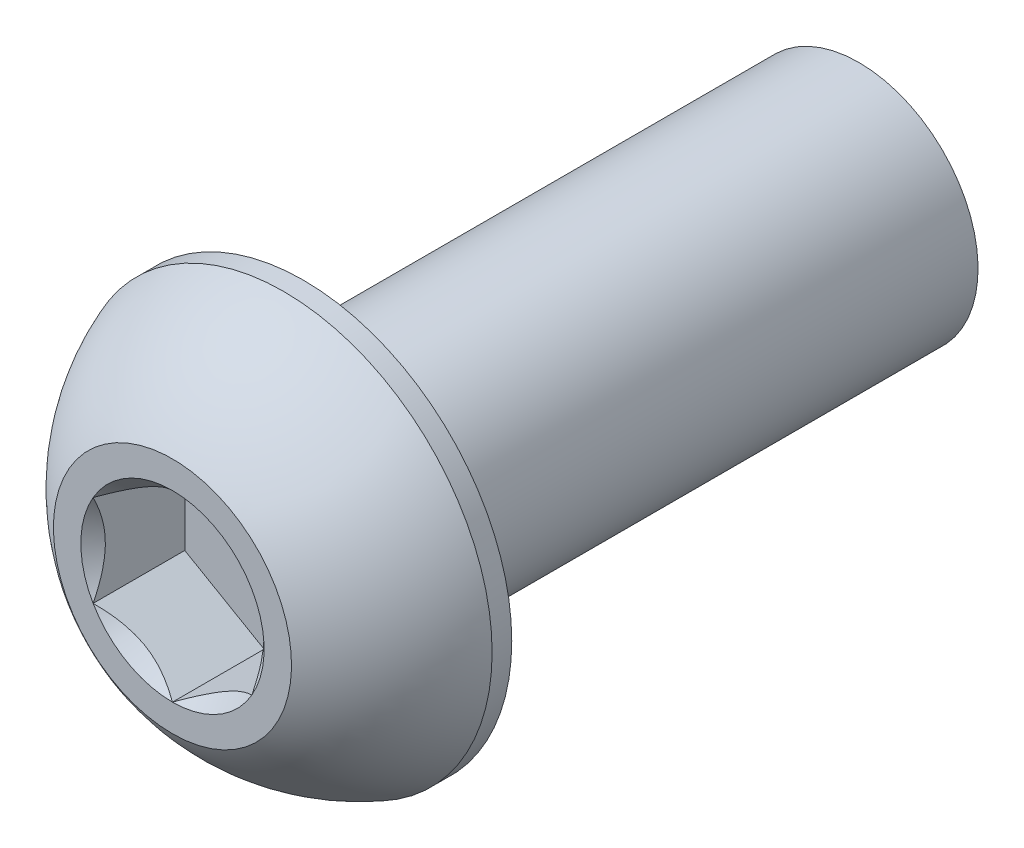
ISO-10303-21;
HEADER;
FILE_DESCRIPTION(('STEP AP214'),'2;1');
FILE_NAME('part.step','',(''),(''),'','','');
FILE_SCHEMA(('AUTOMOTIVE_DESIGN { 1 0 10303 214 1 1 1 1 }'));
ENDSEC;
DATA;
#1=APPLICATION_CONTEXT('core data for automotive mechanical design processes');
#2=APPLICATION_PROTOCOL_DEFINITION('international standard','automotive_design',2000,#1);
#3=PRODUCT_CONTEXT('',#1,'mechanical');
#4=PRODUCT('Part','Part','',(#3));
#5=PRODUCT_RELATED_PRODUCT_CATEGORY('part','',(#4));
#6=PRODUCT_DEFINITION_FORMATION('','',#4);
#7=PRODUCT_DEFINITION_CONTEXT('part definition',#1,'design');
#8=PRODUCT_DEFINITION('design','',#6,#7);
#9=PRODUCT_DEFINITION_SHAPE('','',#8);
#10=(LENGTH_UNIT() NAMED_UNIT(*) SI_UNIT(.MILLI.,.METRE.));
#11=(NAMED_UNIT(*) PLANE_ANGLE_UNIT() SI_UNIT($,.RADIAN.));
#12=(NAMED_UNIT(*) SI_UNIT($,.STERADIAN.) SOLID_ANGLE_UNIT());
#13=UNCERTAINTY_MEASURE_WITH_UNIT(LENGTH_MEASURE(1.E-05),#10,'distance_accuracy_value','');
#14=(GEOMETRIC_REPRESENTATION_CONTEXT(3) GLOBAL_UNCERTAINTY_ASSIGNED_CONTEXT((#13)) GLOBAL_UNIT_ASSIGNED_CONTEXT((#10,
#11,#12)) REPRESENTATION_CONTEXT('',''));
#15=CARTESIAN_POINT('',(0.,0.,0.));
#16=DIRECTION('',(0.,0.,1.));
#17=DIRECTION('',(1.,0.,0.));
#18=AXIS2_PLACEMENT_3D('',#15,#16,#17);
#19=CARTESIAN_POINT('',(-5.26,-5.25,-3.3));
#20=DIRECTION('',(0.,0.,-1.));
#21=DIRECTION('',(0.,1.,0.));
#22=AXIS2_PLACEMENT_3D('',#19,#20,#21);
#23=PLANE('',#22);
#24=CARTESIAN_POINT('',(0.,0.,-3.3));
#25=DIRECTION('',(0.,0.,1.));
#26=DIRECTION('',(1.,0.,0.));
#27=AXIS2_PLACEMENT_3D('',#24,#25,#26);
#28=CIRCLE('',#27,5.25);
#29=CARTESIAN_POINT('',(5.25,0.,-3.3));
#30=VERTEX_POINT('',#29);
#31=EDGE_CURVE('E371',#30,#30,#28,.T.);
#32=ORIENTED_EDGE('',*,*,#31,.F.);
#33=EDGE_LOOP('',(#32));
#34=FACE_BOUND('',#33,.T.);
#35=ADVANCED_FACE('F45',(#34),#23,.T.);
#36=CARTESIAN_POINT('',(2.,-1.15470053837925,-2.31));
#37=DIRECTION('',(0.,0.,1.));
#38=DIRECTION('',(1.,0.,0.));
#39=AXIS2_PLACEMENT_3D('',#36,#37,#38);
#40=PLANE('',#39);
#41=DIRECTION('',(0.866025403784438,0.5,0.));
#42=VECTOR('',#41,1.);
#43=CARTESIAN_POINT('',(0.,-2.3094010767585,-2.31));
#44=LINE('',#43,#42);
#45=CARTESIAN_POINT('',(0.,-2.3094010767585,-2.31));
#46=VERTEX_POINT('',#45);
#47=CARTESIAN_POINT('',(2.,-1.15470053837925,-2.31));
#48=VERTEX_POINT('',#47);
#49=EDGE_CURVE('E111',#46,#48,#44,.T.);
#50=ORIENTED_EDGE('',*,*,#49,.T.);
#51=DIRECTION('',(0.,1.,0.));
#52=VECTOR('',#51,1.);
#53=CARTESIAN_POINT('',(2.,-1.15470053837925,-2.31));
#54=LINE('',#53,#52);
#55=CARTESIAN_POINT('',(2.,1.15470053837925,-2.31));
#56=VERTEX_POINT('',#55);
#57=EDGE_CURVE('E168',#48,#56,#54,.T.);
#58=ORIENTED_EDGE('',*,*,#57,.T.);
#59=DIRECTION('',(-0.866025403784439,0.5,0.));
#60=VECTOR('',#59,1.);
#61=CARTESIAN_POINT('',(2.,1.15470053837925,-2.31));
#62=LINE('',#61,#60);
#63=CARTESIAN_POINT('',(0.,2.3094010767585,-2.31));
#64=VERTEX_POINT('',#63);
#65=EDGE_CURVE('E148',#56,#64,#62,.T.);
#66=ORIENTED_EDGE('',*,*,#65,.T.);
#67=DIRECTION('',(-0.866025403784438,-0.5,0.));
#68=VECTOR('',#67,1.);
#69=CARTESIAN_POINT('',(0.,2.3094010767585,-2.31));
#70=LINE('',#69,#68);
#71=CARTESIAN_POINT('',(-2.,1.15470053837925,-2.31));
#72=VERTEX_POINT('',#71);
#73=EDGE_CURVE('E164',#64,#72,#70,.T.);
#74=ORIENTED_EDGE('',*,*,#73,.T.);
#75=DIRECTION('',(0.,-1.,0.));
#76=VECTOR('',#75,1.);
#77=CARTESIAN_POINT('',(-2.,1.15470053837925,-2.31));
#78=LINE('',#77,#76);
#79=CARTESIAN_POINT('',(-2.,-1.15470053837925,-2.31));
#80=VERTEX_POINT('',#79);
#81=EDGE_CURVE('E161',#72,#80,#78,.T.);
#82=ORIENTED_EDGE('',*,*,#81,.T.);
#83=DIRECTION('',(0.866025403784439,-0.5,0.));
#84=VECTOR('',#83,1.);
#85=CARTESIAN_POINT('',(-2.,-1.15470053837925,-2.31));
#86=LINE('',#85,#84);
#87=EDGE_CURVE('E152',#80,#46,#86,.T.);
#88=ORIENTED_EDGE('',*,*,#87,.T.);
#89=EDGE_LOOP('',(#50,#58,#66,#74,#82,#88));
#90=FACE_BOUND('',#89,.T.);
#91=ADVANCED_FACE('F187',(#90),#40,.T.);
#92=CARTESIAN_POINT('',(-2.,-1.15470053837925,-2.31));
#93=DIRECTION('',(-0.5,-0.866025403784439,0.));
#94=DIRECTION('',(0.866025403784439,-0.5,0.));
#95=AXIS2_PLACEMENT_3D('',#92,#93,#94);
#96=PLANE('',#95);
#97=DIRECTION('',(0.,0.,1.));
#98=VECTOR('',#97,1.);
#99=CARTESIAN_POINT('',(-2.,-1.15470053837925,-2.31));
#100=LINE('',#99,#98);
#101=CARTESIAN_POINT('',(-2.,-1.15470053837925,0.));
#102=VERTEX_POINT('',#101);
#103=EDGE_CURVE('E118',#80,#102,#100,.T.);
#104=ORIENTED_EDGE('',*,*,#103,.T.);
#105=CARTESIAN_POINT('',(-2.0002,-1.15458506832541,0.000115478713659639));
#106=CARTESIAN_POINT('',(-1.93144696596929,-1.19427965103065,-0.039546909774408));
#107=CARTESIAN_POINT('',(-1.86154425786449,-1.23463799837204,-0.0768800177158382));
#108=CARTESIAN_POINT('',(-1.71900475544956,-1.31693321846145,-0.145236314863857));
#109=CARTESIAN_POINT('',(-1.64635440243464,-1.35887791933134,-0.176221466262779));
#110=CARTESIAN_POINT('',(-1.49985839894603,-1.44345742638069,-0.229299783455857));
#111=CARTESIAN_POINT('',(-1.42605006475371,-1.48607068799507,-0.251526372823389));
#112=CARTESIAN_POINT('',(-1.27680836816474,-1.57223542169503,-0.285771183324919));
#113=CARTESIAN_POINT('',(-1.20137956608185,-1.61578426088223,-0.297814970855865));
#114=CARTESIAN_POINT('',(-1.07138449932892,-1.69083694766536,-0.308681488094428));
#115=CARTESIAN_POINT('',(-1.01698621602989,-1.72224381117151,-0.310290246390029));
#116=CARTESIAN_POINT('',(-0.908278544480307,-1.78500621460364,-0.307581122401288));
#117=CARTESIAN_POINT('',(-0.853969194078661,-1.81636173267754,-0.303261162242026));
#118=CARTESIAN_POINT('',(-0.745863272410662,-1.87877671565355,-0.288940432590094));
#119=CARTESIAN_POINT('',(-0.692067343445208,-1.90983580972306,-0.278933307237993));
#120=CARTESIAN_POINT('',(-0.585405737694427,-1.97141691651548,-0.253787569750341));
#121=CARTESIAN_POINT('',(-0.532539989929288,-2.00193897021859,-0.23864935095776));
#122=CARTESIAN_POINT('',(-0.397120266910156,-2.08012358375727,-0.193705496570809));
#123=CARTESIAN_POINT('',(-0.315406165150521,-2.12730124240478,-0.160511160574184));
#124=CARTESIAN_POINT('',(-0.195252962742197,-2.19667172615922,-0.10447417682863));
#125=CARTESIAN_POINT('',(-0.155657147890822,-2.21953238052245,-0.0847852970530592));
#126=CARTESIAN_POINT('',(-0.0771990411121271,-2.26483018959124,-0.0436126816351277));
#127=CARTESIAN_POINT('',(-0.038336316406259,-2.28726759416161,-0.022130048348752));
#128=CARTESIAN_POINT('',(0.000200000000000792,-2.30951654681234,0.000115478713660523));
#129=B_SPLINE_CURVE_WITH_KNOTS('',3,(#105,#106,#107,#108,#109,#110,#111,#112,#113,#114,#115,
#116,#117,#118,#119,#120,#121,#122,#123,#124,#125,#126,#127,#128),.UNSPECIFIED.,.F.,.F.,(4,2,2,
2,2,2,2,2,2,2,2,4),(0.,0.266420613771064,0.534393751523388,0.798110374376914,1.06116288956936,
1.24939906803722,1.43770123566247,1.62621426093932,1.81471283831913,2.11415604834145,
2.26347170717791,2.41269626969771),.UNSPECIFIED.);
#130=CARTESIAN_POINT('',(0.,-2.3094010767585,0.));
#131=VERTEX_POINT('',#130);
#132=EDGE_CURVE('E103',#102,#131,#129,.T.);
#133=ORIENTED_EDGE('',*,*,#132,.T.);
#134=DIRECTION('',(0.,0.,1.));
#135=VECTOR('',#134,1.);
#136=CARTESIAN_POINT('',(0.,-2.3094010767585,-2.31));
#137=LINE('',#136,#135);
#138=EDGE_CURVE('E117',#46,#131,#137,.T.);
#139=ORIENTED_EDGE('',*,*,#138,.F.);
#140=ORIENTED_EDGE('',*,*,#87,.F.);
#141=EDGE_LOOP('',(#104,#133,#139,#140));
#142=FACE_BOUND('',#141,.T.);
#143=ADVANCED_FACE('F115',(#142),#96,.F.);
#144=CARTESIAN_POINT('',(0.,-2.3094010767585,-2.31));
#145=DIRECTION('',(0.5,-0.866025403784438,0.));
#146=DIRECTION('',(0.866025403784438,0.5,0.));
#147=AXIS2_PLACEMENT_3D('',#144,#145,#146);
#148=PLANE('',#147);
#149=ORIENTED_EDGE('',*,*,#138,.T.);
#150=CARTESIAN_POINT('',(-0.000199999999999157,-2.30951654681234,0.000115478713660375));
#151=CARTESIAN_POINT('',(0.0685530340307065,-2.26982196410711,-0.0395469097744072));
#152=CARTESIAN_POINT('',(0.138455742135513,-2.22946361676572,-0.0768800177158376));
#153=CARTESIAN_POINT('',(0.280995244550438,-2.1471683966763,-0.145236314863856));
#154=CARTESIAN_POINT('',(0.35364559756536,-2.10522369580642,-0.176221466262779));
#155=CARTESIAN_POINT('',(0.500141601053973,-2.02064418875706,-0.229299783455857));
#156=CARTESIAN_POINT('',(0.573949935246296,-1.97803092714269,-0.251526372823388));
#157=CARTESIAN_POINT('',(0.723191631835266,-1.89186619344273,-0.285771183324919));
#158=CARTESIAN_POINT('',(0.798620433918153,-1.84831735425552,-0.297814970855864));
#159=CARTESIAN_POINT('',(0.928615500671081,-1.7732646674724,-0.308681488094428));
#160=CARTESIAN_POINT('',(0.98301378397011,-1.74185780396625,-0.310290246390029));
#161=CARTESIAN_POINT('',(1.0917214555197,-1.67909540053412,-0.307581122401288));
#162=CARTESIAN_POINT('',(1.14603080592134,-1.64773988246021,-0.303261162242025));
#163=CARTESIAN_POINT('',(1.25413672758934,-1.5853248994842,-0.288940432590093));
#164=CARTESIAN_POINT('',(1.30793265655479,-1.55426580541469,-0.278933307237993));
#165=CARTESIAN_POINT('',(1.41459426230558,-1.49268469862228,-0.25378756975034));
#166=CARTESIAN_POINT('',(1.46746001007071,-1.46216264491917,-0.238649350957759));
#167=CARTESIAN_POINT('',(1.60287973308985,-1.38397803138049,-0.193705496570809));
#168=CARTESIAN_POINT('',(1.68459383484948,-1.33680037273297,-0.160511160574183));
#169=CARTESIAN_POINT('',(1.8047470372578,-1.26742988897853,-0.10447417682863));
#170=CARTESIAN_POINT('',(1.84434285210918,-1.24456923461531,-0.0847852970530592));
#171=CARTESIAN_POINT('',(1.92280095888787,-1.19927142554652,-0.043612681635128));
#172=CARTESIAN_POINT('',(1.96166368359374,-1.17683402097614,-0.0221300483487526));
#173=CARTESIAN_POINT('',(2.0002,-1.15458506832541,0.000115478713659639));
#174=B_SPLINE_CURVE_WITH_KNOTS('',3,(#150,#151,#152,#153,#154,#155,#156,#157,#158,#159,#160,
#161,#162,#163,#164,#165,#166,#167,#168,#169,#170,#171,#172,#173),.UNSPECIFIED.,.F.,.F.,(4,2,2,
2,2,2,2,2,2,2,2,4),(0.,0.266420613771064,0.534393751523389,0.798110374376915,1.06116288956936,
1.24939906803722,1.43770123566248,1.62621426093932,1.81471283831913,2.11415604834145,
2.26347170717791,2.41269626969771),.UNSPECIFIED.);
#175=CARTESIAN_POINT('',(2.,-1.15470053837925,0.));
#176=VERTEX_POINT('',#175);
#177=EDGE_CURVE('E108',#131,#176,#174,.T.);
#178=ORIENTED_EDGE('',*,*,#177,.T.);
#179=DIRECTION('',(0.,0.,1.));
#180=VECTOR('',#179,1.);
#181=CARTESIAN_POINT('',(2.,-1.15470053837925,-2.31));
#182=LINE('',#181,#180);
#183=EDGE_CURVE('E66',#48,#176,#182,.T.);
#184=ORIENTED_EDGE('',*,*,#183,.F.);
#185=ORIENTED_EDGE('',*,*,#49,.F.);
#186=EDGE_LOOP('',(#149,#178,#184,#185));
#187=FACE_BOUND('',#186,.T.);
#188=ADVANCED_FACE('F121',(#187),#148,.F.);
#189=CARTESIAN_POINT('',(2.,-1.15470053837925,-2.31));
#190=DIRECTION('',(1.,0.,0.));
#191=DIRECTION('',(0.,0.,-1.));
#192=AXIS2_PLACEMENT_3D('',#189,#190,#191);
#193=PLANE('',#192);
#194=ORIENTED_EDGE('',*,*,#183,.T.);
#195=CARTESIAN_POINT('',(2.,-2.30294417292923,0.740771355027722));
#196=CARTESIAN_POINT('',(2.,-2.24687002663712,0.698443273625964));
#197=CARTESIAN_POINT('',(2.,-2.19048190536959,0.656525156864338));
#198=CARTESIAN_POINT('',(2.,-2.07695390496424,0.573690417861018));
#199=CARTESIAN_POINT('',(2.,-2.01981384066454,0.532774049668075));
#200=CARTESIAN_POINT('',(2.,-1.90424016804776,0.451833452018564));
#201=CARTESIAN_POINT('',(2.,-1.8457999674391,0.411818591559869));
#202=CARTESIAN_POINT('',(2.,-1.7279274546176,0.333288993664294));
#203=CARTESIAN_POINT('',(2.,-1.66849521292324,0.294774150243143));
#204=CARTESIAN_POINT('',(2.,-1.4816299571002,0.177640651604295));
#205=CARTESIAN_POINT('',(2.,-1.35220318163536,0.102145901729644));
#206=CARTESIAN_POINT('',(2.,-1.08689521592924,-0.0359506490056185));
#207=CARTESIAN_POINT('',(2.,-0.951037763938192,-0.0985959140965039));
#208=CARTESIAN_POINT('',(2.,-0.747111912259408,-0.175236456124856));
#209=CARTESIAN_POINT('',(2.,-0.682064034147875,-0.197232820080877));
#210=CARTESIAN_POINT('',(2.,-0.550398103294752,-0.23600331233986));
#211=CARTESIAN_POINT('',(2.,-0.483779942722475,-0.252777080878817));
#212=CARTESIAN_POINT('',(2.,-0.350484328847654,-0.279951742115554));
#213=CARTESIAN_POINT('',(2.,-0.283829489364785,-0.290461823258313));
#214=CARTESIAN_POINT('',(2.,-0.149806987139376,-0.304903914455084));
#215=CARTESIAN_POINT('',(2.,-0.0824394489341213,-0.308837055266886));
#216=CARTESIAN_POINT('',(2.,0.0499055622944902,-0.309833523066282));
#217=CARTESIAN_POINT('',(2.,0.114881285143173,-0.307140355149591));
#218=CARTESIAN_POINT('',(2.,0.244275921482761,-0.295569929577307));
#219=CARTESIAN_POINT('',(2.,0.308694780266754,-0.286692071166775));
#220=CARTESIAN_POINT('',(2.,0.437599788610705,-0.263086340703851));
#221=CARTESIAN_POINT('',(2.,0.502067428644596,-0.248258916553488));
#222=CARTESIAN_POINT('',(2.,0.629594322598307,-0.21354211637203));
#223=CARTESIAN_POINT('',(2.,0.692653693883151,-0.193653163893724));
#224=CARTESIAN_POINT('',(2.,0.891187889210545,-0.123553020743801));
#225=CARTESIAN_POINT('',(2.,1.02383545707306,-0.065358199678491));
#226=CARTESIAN_POINT('',(2.,1.28290932150074,0.0640305754595764));
#227=CARTESIAN_POINT('',(2.,1.4093111258757,0.135271231414842));
#228=CARTESIAN_POINT('',(2.,1.59200441438963,0.246441991874721));
#229=CARTESIAN_POINT('',(2.,1.65027549026191,0.283182190337375));
#230=CARTESIAN_POINT('',(2.,1.76581760389243,0.358214514183766));
#231=CARTESIAN_POINT('',(2.,1.82308856543105,0.396506757118039));
#232=CARTESIAN_POINT('',(2.,1.93629654762084,0.474042264081225));
#233=CARTESIAN_POINT('',(2.,1.99224062500539,0.513275276133585));
#234=CARTESIAN_POINT('',(2.,2.103364240299,0.592778830736515));
#235=CARTESIAN_POINT('',(2.,2.15854398422468,0.633049085000597));
#236=CARTESIAN_POINT('',(2.,2.21340370692659,0.673744238145941));
#237=B_SPLINE_CURVE_WITH_KNOTS('',3,(#195,#196,#197,#198,#199,#200,#201,#202,#203,#204,#205,
#206,#207,#208,#209,#210,#211,#212,#213,#214,#215,#216,#217,#218,#219,#220,#221,#222,#223,#224,
#225,#226,#227,#228,#229,#230,#231,#232,#233,#234,#235,#236),.UNSPECIFIED.,.F.,.F.,(4,2,2,2,2,2,
2,2,2,2,2,2,2,2,2,2,2,2,2,2,4),(0.,0.210772731976892,0.42159837465859,0.634057554623488,
0.84650169587017,1.29562155455624,1.74319622821645,1.94902062110207,2.15485918928326,
2.35699582502635,2.5590977043214,2.75388435553556,2.94868993014815,3.14690093452586,
3.34509535789702,3.77838155837654,4.21325029921625,4.41989056685647,4.62654651460921,
4.83152377111289,5.03644465914085),.UNSPECIFIED.);
#238=CARTESIAN_POINT('',(2.,1.15470053837925,0.));
#239=VERTEX_POINT('',#238);
#240=EDGE_CURVE('E134',#176,#239,#237,.T.);
#241=ORIENTED_EDGE('',*,*,#240,.T.);
#242=DIRECTION('',(0.,0.,1.));
#243=VECTOR('',#242,1.);
#244=CARTESIAN_POINT('',(2.,1.15470053837925,-2.31));
#245=LINE('',#244,#243);
#246=EDGE_CURVE('E138',#56,#239,#245,.T.);
#247=ORIENTED_EDGE('',*,*,#246,.F.);
#248=ORIENTED_EDGE('',*,*,#57,.F.);
#249=EDGE_LOOP('',(#194,#241,#247,#248));
#250=FACE_BOUND('',#249,.T.);
#251=ADVANCED_FACE('F137',(#250),#193,.F.);
#252=CARTESIAN_POINT('',(2.,1.15470053837925,-2.31));
#253=DIRECTION('',(0.5,0.866025403784439,0.));
#254=DIRECTION('',(-0.866025403784439,0.5,0.));
#255=AXIS2_PLACEMENT_3D('',#252,#253,#254);
#256=PLANE('',#255);
#257=ORIENTED_EDGE('',*,*,#246,.T.);
#258=CARTESIAN_POINT('',(2.0002,1.15458506832541,0.000115478713659639));
#259=CARTESIAN_POINT('',(1.93144696596929,1.19427965103065,-0.0395469097744079));
#260=CARTESIAN_POINT('',(1.86154425786449,1.23463799837204,-0.0768800177158382));
#261=CARTESIAN_POINT('',(1.71900475544956,1.31693321846145,-0.145236314863857));
#262=CARTESIAN_POINT('',(1.64635440243464,1.35887791933134,-0.17622146626278));
#263=CARTESIAN_POINT('',(1.49985839894603,1.44345742638069,-0.229299783455858));
#264=CARTESIAN_POINT('',(1.4260500647537,1.48607068799507,-0.25152637282339));
#265=CARTESIAN_POINT('',(1.27680836816473,1.57223542169503,-0.28577118332492));
#266=CARTESIAN_POINT('',(1.20137956608185,1.61578426088223,-0.297814970855865));
#267=CARTESIAN_POINT('',(1.07138449932892,1.69083694766536,-0.308681488094429));
#268=CARTESIAN_POINT('',(1.01698621602989,1.72224381117151,-0.31029024639003));
#269=CARTESIAN_POINT('',(0.908278544480305,1.78500621460364,-0.307581122401289));
#270=CARTESIAN_POINT('',(0.85396919407866,1.81636173267754,-0.303261162242026));
#271=CARTESIAN_POINT('',(0.745863272410661,1.87877671565355,-0.288940432590094));
#272=CARTESIAN_POINT('',(0.692067343445206,1.90983580972306,-0.278933307237994));
#273=CARTESIAN_POINT('',(0.585405737694425,1.97141691651547,-0.253787569750341));
#274=CARTESIAN_POINT('',(0.532539989929286,2.00193897021859,-0.238649350957761));
#275=CARTESIAN_POINT('',(0.397120266910155,2.08012358375727,-0.19370549657081));
#276=CARTESIAN_POINT('',(0.31540616515052,2.12730124240478,-0.160511160574185));
#277=CARTESIAN_POINT('',(0.195252962742197,2.19667172615922,-0.104474176828631));
#278=CARTESIAN_POINT('',(0.155657147890822,2.21953238052245,-0.0847852970530605));
#279=CARTESIAN_POINT('',(0.0771990411121276,2.26483018959123,-0.0436126816351292));
#280=CARTESIAN_POINT('',(0.0383363164062596,2.28726759416161,-0.0221300483487536));
#281=CARTESIAN_POINT('',(-0.000200000000000117,2.30951654681234,0.00011547871365879));
#282=B_SPLINE_CURVE_WITH_KNOTS('',3,(#258,#259,#260,#261,#262,#263,#264,#265,#266,#267,#268,
#269,#270,#271,#272,#273,#274,#275,#276,#277,#278,#279,#280,#281),.UNSPECIFIED.,.F.,.F.,(4,2,2,
2,2,2,2,2,2,2,2,4),(0.,0.266420613771064,0.534393751523389,0.798110374376916,1.06116288956937,
1.24939906803722,1.43770123566248,1.62621426093932,1.81471283831913,2.11415604834145,
2.2634717071779,2.41269626969771),.UNSPECIFIED.);
#283=CARTESIAN_POINT('',(0.,2.3094010767585,0.));
#284=VERTEX_POINT('',#283);
#285=EDGE_CURVE('E145',#239,#284,#282,.T.);
#286=ORIENTED_EDGE('',*,*,#285,.T.);
#287=DIRECTION('',(0.,0.,1.));
#288=VECTOR('',#287,1.);
#289=CARTESIAN_POINT('',(0.,2.3094010767585,-2.31));
#290=LINE('',#289,#288);
#291=EDGE_CURVE('E150',#64,#284,#290,.T.);
#292=ORIENTED_EDGE('',*,*,#291,.F.);
#293=ORIENTED_EDGE('',*,*,#65,.F.);
#294=EDGE_LOOP('',(#257,#286,#292,#293));
#295=FACE_BOUND('',#294,.T.);
#296=ADVANCED_FACE('F144',(#295),#256,.F.);
#297=CARTESIAN_POINT('',(0.,2.3094010767585,-2.31));
#298=DIRECTION('',(-0.5,0.866025403784438,0.));
#299=DIRECTION('',(-0.866025403784438,-0.5,0.));
#300=AXIS2_PLACEMENT_3D('',#297,#298,#299);
#301=PLANE('',#300);
#302=ORIENTED_EDGE('',*,*,#291,.T.);
#303=CARTESIAN_POINT('',(0.000199999999999811,2.30951654681234,0.000115478713659074));
#304=CARTESIAN_POINT('',(-0.0685530340307058,2.26982196410711,-0.0395469097744086));
#305=CARTESIAN_POINT('',(-0.138455742135512,2.22946361676572,-0.0768800177158388));
#306=CARTESIAN_POINT('',(-0.280995244550437,2.1471683966763,-0.145236314863858));
#307=CARTESIAN_POINT('',(-0.353645597565359,2.10522369580642,-0.17622146626278));
#308=CARTESIAN_POINT('',(-0.500141601053972,2.02064418875706,-0.229299783455858));
#309=CARTESIAN_POINT('',(-0.573949935246295,1.97803092714269,-0.25152637282339));
#310=CARTESIAN_POINT('',(-0.723191631835265,1.89186619344273,-0.28577118332492));
#311=CARTESIAN_POINT('',(-0.798620433918153,1.84831735425552,-0.297814970855866));
#312=CARTESIAN_POINT('',(-0.92861550067108,1.7732646674724,-0.308681488094429));
#313=CARTESIAN_POINT('',(-0.98301378397011,1.74185780396625,-0.31029024639003));
#314=CARTESIAN_POINT('',(-1.09172145551969,1.67909540053412,-0.30758112240129));
#315=CARTESIAN_POINT('',(-1.14603080592134,1.64773988246021,-0.303261162242027));
#316=CARTESIAN_POINT('',(-1.25413672758934,1.5853248994842,-0.288940432590095));
#317=CARTESIAN_POINT('',(-1.30793265655479,1.55426580541469,-0.278933307237995));
#318=CARTESIAN_POINT('',(-1.41459426230557,1.49268469862228,-0.253787569750342));
#319=CARTESIAN_POINT('',(-1.46746001007071,1.46216264491916,-0.238649350957761));
#320=CARTESIAN_POINT('',(-1.60287973308984,1.38397803138048,-0.19370549657081));
#321=CARTESIAN_POINT('',(-1.68459383484948,1.33680037273297,-0.160511160574184));
#322=CARTESIAN_POINT('',(-1.8047470372578,1.26742988897853,-0.104474176828631));
#323=CARTESIAN_POINT('',(-1.84434285210918,1.24456923461531,-0.0847852970530608));
#324=CARTESIAN_POINT('',(-1.92280095888787,1.19927142554652,-0.0436126816351296));
#325=CARTESIAN_POINT('',(-1.96166368359374,1.17683402097614,-0.0221300483487539));
#326=CARTESIAN_POINT('',(-2.0002,1.15458506832541,0.000115478713658797));
#327=B_SPLINE_CURVE_WITH_KNOTS('',3,(#303,#304,#305,#306,#307,#308,#309,#310,#311,#312,#313,
#314,#315,#316,#317,#318,#319,#320,#321,#322,#323,#324,#325,#326),.UNSPECIFIED.,.F.,.F.,(4,2,2,
2,2,2,2,2,2,2,2,4),(0.,0.266420613771064,0.534393751523389,0.798110374376915,1.06116288956936,
1.24939906803722,1.43770123566248,1.62621426093932,1.81471283831913,2.11415604834145,
2.26347170717791,2.41269626969771),.UNSPECIFIED.);
#328=CARTESIAN_POINT('',(-2.,1.15470053837925,0.));
#329=VERTEX_POINT('',#328);
#330=EDGE_CURVE('E204',#284,#329,#327,.T.);
#331=ORIENTED_EDGE('',*,*,#330,.T.);
#332=DIRECTION('',(0.,0.,1.));
#333=VECTOR('',#332,1.);
#334=CARTESIAN_POINT('',(-2.,1.15470053837925,-2.31));
#335=LINE('',#334,#333);
#336=EDGE_CURVE('E154',#72,#329,#335,.T.);
#337=ORIENTED_EDGE('',*,*,#336,.F.);
#338=ORIENTED_EDGE('',*,*,#73,.F.);
#339=EDGE_LOOP('',(#302,#331,#337,#338));
#340=FACE_BOUND('',#339,.T.);
#341=ADVANCED_FACE('F218',(#340),#301,.F.);
#342=CARTESIAN_POINT('',(-2.,1.15470053837925,-2.31));
#343=DIRECTION('',(-1.,0.,0.));
#344=DIRECTION('',(0.,0.,1.));
#345=AXIS2_PLACEMENT_3D('',#342,#343,#344);
#346=PLANE('',#345);
#347=ORIENTED_EDGE('',*,*,#336,.T.);
#348=CARTESIAN_POINT('',(-2.,-2.30294417292923,0.740771355027724));
#349=CARTESIAN_POINT('',(-2.,-2.24687002663712,0.698443273625966));
#350=CARTESIAN_POINT('',(-2.,-2.19048190536959,0.65652515686434));
#351=CARTESIAN_POINT('',(-2.,-2.07695390496424,0.57369041786102));
#352=CARTESIAN_POINT('',(-2.,-2.01981384066454,0.532774049668076));
#353=CARTESIAN_POINT('',(-2.,-1.90424016804776,0.451833452018565));
#354=CARTESIAN_POINT('',(-2.,-1.8457999674391,0.41181859155987));
#355=CARTESIAN_POINT('',(-2.,-1.7279274546176,0.333288993664295));
#356=CARTESIAN_POINT('',(-2.,-1.66849521292324,0.294774150243144));
#357=CARTESIAN_POINT('',(-2.,-1.4816299571002,0.177640651604296));
#358=CARTESIAN_POINT('',(-2.,-1.35220318163536,0.102145901729645));
#359=CARTESIAN_POINT('',(-2.,-1.08689521592925,-0.0359506490056179));
#360=CARTESIAN_POINT('',(-2.,-0.951037763938192,-0.0985959140965036));
#361=CARTESIAN_POINT('',(-2.,-0.747111912259409,-0.175236456124856));
#362=CARTESIAN_POINT('',(-2.,-0.682064034147876,-0.197232820080876));
#363=CARTESIAN_POINT('',(-2.,-0.550398103294752,-0.23600331233986));
#364=CARTESIAN_POINT('',(-2.,-0.483779942722475,-0.252777080878817));
#365=CARTESIAN_POINT('',(-2.,-0.350484328847654,-0.279951742115554));
#366=CARTESIAN_POINT('',(-2.,-0.283829489364785,-0.290461823258313));
#367=CARTESIAN_POINT('',(-2.,-0.149806987139376,-0.304903914455084));
#368=CARTESIAN_POINT('',(-2.,-0.0824394489341216,-0.308837055266886));
#369=CARTESIAN_POINT('',(-2.,0.04990556229449,-0.309833523066282));
#370=CARTESIAN_POINT('',(-2.,0.114881285143172,-0.307140355149591));
#371=CARTESIAN_POINT('',(-2.,0.244275921482761,-0.295569929577307));
#372=CARTESIAN_POINT('',(-2.,0.308694780266753,-0.286692071166775));
#373=CARTESIAN_POINT('',(-2.,0.437599788610705,-0.263086340703851));
#374=CARTESIAN_POINT('',(-2.,0.502067428644595,-0.248258916553488));
#375=CARTESIAN_POINT('',(-2.,0.629594322598306,-0.21354211637203));
#376=CARTESIAN_POINT('',(-2.,0.692653693883151,-0.193653163893724));
#377=CARTESIAN_POINT('',(-2.,0.891187889210545,-0.123553020743801));
#378=CARTESIAN_POINT('',(-2.,1.02383545707306,-0.0653581996784915));
#379=CARTESIAN_POINT('',(-2.,1.28290932150074,0.0640305754595762));
#380=CARTESIAN_POINT('',(-2.,1.4093111258757,0.135271231414841));
#381=CARTESIAN_POINT('',(-2.,1.59200441438963,0.24644199187472));
#382=CARTESIAN_POINT('',(-2.,1.65027549026191,0.283182190337374));
#383=CARTESIAN_POINT('',(-2.,1.76581760389243,0.358214514183765));
#384=CARTESIAN_POINT('',(-2.,1.82308856543104,0.396506757118039));
#385=CARTESIAN_POINT('',(-2.,1.93629654762084,0.474042264081225));
#386=CARTESIAN_POINT('',(-2.,1.99224062500539,0.513275276133584));
#387=CARTESIAN_POINT('',(-2.,2.103364240299,0.592778830736514));
#388=CARTESIAN_POINT('',(-2.,2.15854398422468,0.633049085000596));
#389=CARTESIAN_POINT('',(-2.,2.21340370692658,0.673744238145941));
#390=B_SPLINE_CURVE_WITH_KNOTS('',3,(#348,#349,#350,#351,#352,#353,#354,#355,#356,#357,#358,
#359,#360,#361,#362,#363,#364,#365,#366,#367,#368,#369,#370,#371,#372,#373,#374,#375,#376,#377,
#378,#379,#380,#381,#382,#383,#384,#385,#386,#387,#388,#389),.UNSPECIFIED.,.F.,.F.,(4,2,2,2,2,2,
2,2,2,2,2,2,2,2,2,2,2,2,2,2,4),(0.,0.210772731976892,0.42159837465859,0.634057554623489,
0.846501695870171,1.29562155455624,1.74319622821645,1.94902062110208,2.15485918928326,
2.35699582502636,2.5590977043214,2.75388435553556,2.94868993014815,3.14690093452586,
3.34509535789702,3.77838155837654,4.21325029921625,4.41989056685647,4.62654651460921,
4.8315237711129,5.03644465914085),.UNSPECIFIED.);
#391=EDGE_CURVE('E119',#329,#102,#390,.F.);
#392=ORIENTED_EDGE('',*,*,#391,.T.);
#393=ORIENTED_EDGE('',*,*,#103,.F.);
#394=ORIENTED_EDGE('',*,*,#81,.F.);
#395=EDGE_LOOP('',(#347,#392,#393,#394));
#396=FACE_BOUND('',#395,.T.);
#397=ADVANCED_FACE('F215',(#396),#346,.F.);
#398=CARTESIAN_POINT('',(0.,0.,0.));
#399=DIRECTION('',(0.,0.,1.));
#400=DIRECTION('',(1.,0.,0.));
#401=AXIS2_PLACEMENT_3D('',#398,#399,#400);
#402=CONICAL_SURFACE('',#401,2.3094010767585,0.78539816339745);
#403=CARTESIAN_POINT('',(0.,0.,0.));
#404=DIRECTION('',(0.,0.,1.));
#405=DIRECTION('',(1.,0.,0.));
#406=AXIS2_PLACEMENT_3D('',#403,#404,#405);
#407=CIRCLE('',#406,2.3094010767585);
#408=EDGE_CURVE('E100',#102,#131,#407,.T.);
#409=ORIENTED_EDGE('',*,*,#408,.T.);
#410=ORIENTED_EDGE('',*,*,#132,.F.);
#411=EDGE_LOOP('',(#409,#410));
#412=FACE_BOUND('',#411,.T.);
#413=ADVANCED_FACE('F101',(#412),#402,.F.);
#414=EDGE_CURVE('E53',#131,#176,#407,.T.);
#415=ORIENTED_EDGE('',*,*,#414,.T.);
#416=ORIENTED_EDGE('',*,*,#177,.F.);
#417=EDGE_LOOP('',(#415,#416));
#418=FACE_BOUND('',#417,.T.);
#419=ADVANCED_FACE('F109',(#418),#402,.F.);
#420=EDGE_CURVE('E12',#176,#239,#407,.T.);
#421=ORIENTED_EDGE('',*,*,#420,.T.);
#422=ORIENTED_EDGE('',*,*,#240,.F.);
#423=EDGE_LOOP('',(#421,#422));
#424=FACE_BOUND('',#423,.T.);
#425=ADVANCED_FACE('F133',(#424),#402,.F.);
#426=EDGE_CURVE('E48',#239,#284,#407,.T.);
#427=ORIENTED_EDGE('',*,*,#426,.T.);
#428=ORIENTED_EDGE('',*,*,#285,.F.);
#429=EDGE_LOOP('',(#427,#428));
#430=FACE_BOUND('',#429,.T.);
#431=ADVANCED_FACE('F317',(#430),#402,.F.);
#432=EDGE_CURVE('E242',#284,#329,#407,.T.);
#433=ORIENTED_EDGE('',*,*,#432,.T.);
#434=ORIENTED_EDGE('',*,*,#330,.F.);
#435=EDGE_LOOP('',(#433,#434));
#436=FACE_BOUND('',#435,.T.);
#437=ADVANCED_FACE('F243',(#436),#402,.F.);
#438=EDGE_CURVE('E107',#329,#102,#407,.T.);
#439=ORIENTED_EDGE('',*,*,#438,.T.);
#440=ORIENTED_EDGE('',*,*,#391,.F.);
#441=EDGE_LOOP('',(#439,#440));
#442=FACE_BOUND('',#441,.T.);
#443=ADVANCED_FACE('F239',(#442),#402,.F.);
#444=CARTESIAN_POINT('',(0.,-3.,0.));
#445=DIRECTION('',(0.,0.,-1.));
#446=DIRECTION('',(-1.,0.,0.));
#447=AXIS2_PLACEMENT_3D('',#444,#445,#446);
#448=PLANE('',#447);
#449=ORIENTED_EDGE('',*,*,#438,.F.);
#450=ORIENTED_EDGE('',*,*,#432,.F.);
#451=ORIENTED_EDGE('',*,*,#426,.F.);
#452=ORIENTED_EDGE('',*,*,#420,.F.);
#453=ORIENTED_EDGE('',*,*,#414,.F.);
#454=ORIENTED_EDGE('',*,*,#408,.F.);
#455=EDGE_LOOP('',(#449,#450,#451,#452,#453,#454));
#456=FACE_BOUND('',#455,.T.);
#457=CARTESIAN_POINT('',(0.,0.,0.));
#458=DIRECTION('',(0.,0.,1.));
#459=DIRECTION('',(1.,0.,0.));
#460=AXIS2_PLACEMENT_3D('',#457,#458,#459);
#461=CIRCLE('',#460,3.);
#462=CARTESIAN_POINT('',(0.,-3.,0.));
#463=VERTEX_POINT('',#462);
#464=EDGE_CURVE('E140',#463,#463,#461,.T.);
#465=ORIENTED_EDGE('',*,*,#464,.T.);
#466=EDGE_LOOP('',(#465));
#467=FACE_BOUND('',#466,.T.);
#468=ADVANCED_FACE('F127',(#456,#467),#448,.F.);
#469=CARTESIAN_POINT('',(0.,0.,-4.71132352941176));
#470=DIRECTION('',(0.,0.,1.));
#471=DIRECTION('',(0.,-1.,0.));
#472=AXIS2_PLACEMENT_3D('',#469,#470,#471);
#473=SPHERICAL_SURFACE('',#472,5.58538892099636);
#474=CARTESIAN_POINT('',(0.,0.,-2.805));
#475=DIRECTION('',(0.,0.,1.));
#476=DIRECTION('',(1.,0.,0.));
#477=AXIS2_PLACEMENT_3D('',#474,#475,#476);
#478=CIRCLE('',#477,5.25);
#479=CARTESIAN_POINT('',(0.,-5.25,-2.805));
#480=VERTEX_POINT('',#479);
#481=EDGE_CURVE('E124',#480,#480,#478,.T.);
#482=CARTESIAN_POINT('',(0.,-3.,0.));
#483=CARTESIAN_POINT('',(0.,-3.03216841047471,-0.0204836076687066));
#484=CARTESIAN_POINT('',(0.,-3.06412696701745,-0.0412967747060141));
#485=CARTESIAN_POINT('',(0.,-3.12761110680185,-0.0835732798883749));
#486=CARTESIAN_POINT('',(0.,-3.1591366900435,-0.105036618033428));
#487=CARTESIAN_POINT('',(0.,-3.22174161778855,-0.148604517801823));
#488=CARTESIAN_POINT('',(0.,-3.25282096229196,-0.170709079425165));
#489=CARTESIAN_POINT('',(0.,-3.3145203830256,-0.215550136391722));
#490=CARTESIAN_POINT('',(0.,-3.34514045925583,-0.238286631734938));
#491=CARTESIAN_POINT('',(0.,-3.40590849355866,-0.284382020830628));
#492=CARTESIAN_POINT('',(0.,-3.43605645163127,-0.307740914583101));
#493=CARTESIAN_POINT('',(0.,-3.49586760131366,-0.355071298801884));
#494=CARTESIAN_POINT('',(0.,-3.52553079292345,-0.379042789268193));
#495=CARTESIAN_POINT('',(0.,-3.58435996382991,-0.427588309600936));
#496=CARTESIAN_POINT('',(0.,-3.61352594312657,-0.45216233946737));
#497=CARTESIAN_POINT('',(0.,-3.67134845242053,-0.501902628105113));
#498=CARTESIAN_POINT('',(0.,-3.70000498241782,-0.527068886876421));
#499=CARTESIAN_POINT('',(0.,-3.7567965698069,-0.577983074450791));
#500=CARTESIAN_POINT('',(0.,-3.78493162719868,-0.603731003253852));
#501=CARTESIAN_POINT('',(0.,-3.84066846488056,-0.655797727942868));
#502=CARTESIAN_POINT('',(0.,-3.86827024517066,-0.682116523828822));
#503=CARTESIAN_POINT('',(0.,-3.92292894789283,-0.735313940225864));
#504=CARTESIAN_POINT('',(0.,-3.94998587032491,-0.762192560736952));
#505=CARTESIAN_POINT('',(0.,-4.00354350517958,-0.816498349041451));
#506=CARTESIAN_POINT('',(0.,-4.03004421760217,-0.843925516834863));
#507=CARTESIAN_POINT('',(0.,-4.08247831365261,-0.899316892210193));
#508=CARTESIAN_POINT('',(0.,-4.10841169728045,-0.927281099792112));
#509=CARTESIAN_POINT('',(0.,-4.1597002549878,-0.983734821927125));
#510=CARTESIAN_POINT('',(0.,-4.18505542906731,-1.01222433648022));
#511=CARTESIAN_POINT('',(0.,-4.23517692952119,-1.06971671933959));
#512=CARTESIAN_POINT('',(0.,-4.25994325589556,-1.09871958764587));
#513=CARTESIAN_POINT('',(0.,-4.30887666984256,-1.15722650940808));
#514=CARTESIAN_POINT('',(0.,-4.33304375741518,-1.18673056286401));
#515=CARTESIAN_POINT('',(0.,-4.38076855408201,-1.24622747604199));
#516=CARTESIAN_POINT('',(0.,-4.40432626317621,-1.27622033576403));
#517=CARTESIAN_POINT('',(0.,-4.45082241888372,-1.33668227750444));
#518=CARTESIAN_POINT('',(0.,-4.47376086549703,-1.3671513595228));
#519=CARTESIAN_POINT('',(0.,-4.51900887206146,-1.4285529620796));
#520=CARTESIAN_POINT('',(0.,-4.54131843201258,-1.45948548261803));
#521=CARTESIAN_POINT('',(0.,-4.58529930493053,-1.52180098399588));
#522=CARTESIAN_POINT('',(0.,-4.60697061789735,-1.5531839648353));
#523=CARTESIAN_POINT('',(0.,-4.64966590431095,-1.61638721959847));
#524=CARTESIAN_POINT('',(0.,-4.67068987775773,-1.64820749352221));
#525=CARTESIAN_POINT('',(0.,-4.71208166419702,-1.71227198376418));
#526=CARTESIAN_POINT('',(0.,-4.73244947718953,-1.74451620008241));
#527=CARTESIAN_POINT('',(0.,-4.77252039708775,-1.80941504655213));
#528=CARTESIAN_POINT('',(0.,-4.79222350399347,-1.84206967670363));
#529=CARTESIAN_POINT('',(0.,-4.83095674497554,-1.90777565008234));
#530=CARTESIAN_POINT('',(0.,-4.84998687905189,-1.94082699330955));
#531=CARTESIAN_POINT('',(0.,-4.8873661899807,-2.00731252563814));
#532=CARTESIAN_POINT('',(0.,-4.90571536683316,-2.04074671473953));
#533=CARTESIAN_POINT('',(0.,-4.94172506465618,-2.10798391097428));
#534=CARTESIAN_POINT('',(0.,-4.95938558562673,-2.14178691810765));
#535=CARTESIAN_POINT('',(0.,-4.99401056185103,-2.20974756786458));
#536=CARTESIAN_POINT('',(0.,-5.01097501710478,-2.24390521048815));
#537=CARTESIAN_POINT('',(0.,-5.04420074452798,-2.31256079972767));
#538=CARTESIAN_POINT('',(0.,-5.06046201669743,-2.34705874634363));
#539=CARTESIAN_POINT('',(0.,-5.09227455404011,-2.41638046989934));
#540=CARTESIAN_POINT('',(0.,-5.10782581921333,-2.45120424683909));
#541=CARTESIAN_POINT('',(0.,-5.13821182242717,-2.52116301839372));
#542=CARTESIAN_POINT('',(0.,-5.15304656046779,-2.5562980130086));
#543=CARTESIAN_POINT('',(0.,-5.18199326796146,-2.62686448517116));
#544=CARTESIAN_POINT('',(0.,-5.19610523741451,-2.66229596271883));
#545=CARTESIAN_POINT('',(0.,-5.22360055144049,-2.7334405099534));
#546=CARTESIAN_POINT('',(0.,-5.23698389601341,-2.76915357964029));
#547=CARTESIAN_POINT('',(0.,-5.25,-2.805));
#548=B_SPLINE_CURVE_WITH_KNOTS('',3,(#482,#483,#484,#485,#486,#487,#488,#489,#490,#491,#492,
#493,#494,#495,#496,#497,#498,#499,#500,#501,#502,#503,#504,#505,#506,#507,#508,#509,#510,#511,
#512,#513,#514,#515,#516,#517,#518,#519,#520,#521,#522,#523,#524,#525,#526,#527,#528,#529,#530,
#531,#532,#533,#534,#535,#536,#537,#538,#539,#540,#541,#542,#543,#544,#545,#546,#547),
.UNSPECIFIED.,.F.,.F.,(4,2,2,2,2,2,2,2,2,2,2,2,2,2,2,2,2,2,2,2,2,2,2,2,2,2,2,2,2,2,2,2,4),(0.,
0.114407188898184,0.228814377796368,0.343221566694552,0.457628755592736,0.57203594449092,
0.686443133389104,0.800850322287288,0.915257511185472,1.02966470008366,1.14407188898184,
1.25847907788002,1.37288626677821,1.48729345567639,1.60170064457458,1.71610783347276,
1.83051502237094,1.94492221126913,2.05932940016731,2.17373658906549,2.28814377796368,
2.40255096686186,2.51695815576005,2.63136534465823,2.74577253355642,2.8601797224546,
2.97458691135278,3.08899410025097,3.20340128914915,3.31780847804733,3.43221566694552,
3.5466228558437,3.66103004474189),.UNSPECIFIED.);
#549=EDGE_CURVE('BSEAM288',#463,#480,#548,.T.);
#550=ORIENTED_EDGE('',*,*,#464,.F.);
#551=ORIENTED_EDGE('',*,*,#481,.T.);
#552=ORIENTED_EDGE('',*,*,#549,.T.);
#553=ORIENTED_EDGE('',*,*,#549,.F.);
#554=EDGE_LOOP('',(#550,#552,#551,#553));
#555=FACE_BOUND('',#554,.T.);
#556=ADVANCED_FACE('F288',(#555),#473,.T.);
#557=CARTESIAN_POINT('',(0.,0.,0.));
#558=DIRECTION('',(0.,0.,1.));
#559=DIRECTION('',(1.,0.,0.));
#560=AXIS2_PLACEMENT_3D('',#557,#558,#559);
#561=CYLINDRICAL_SURFACE('',#560,5.25);
#562=ORIENTED_EDGE('',*,*,#481,.F.);
#563=EDGE_LOOP('',(#562));
#564=FACE_BOUND('',#563,.T.);
#565=ORIENTED_EDGE('',*,*,#31,.T.);
#566=EDGE_LOOP('',(#565));
#567=FACE_BOUND('',#566,.T.);
#568=ADVANCED_FACE('F232',(#564,#567),#561,.T.);
#569=CLOSED_SHELL('',(#35,#91,#143,#188,#251,#296,#341,#397,#413,#419,#425,#431,#437,#443,#468,
#556,#568));
#570=MANIFOLD_SOLID_BREP('B2',#569);
#571=CARTESIAN_POINT('',(-5.26,-5.25,-3.3));
#572=DIRECTION('',(0.,0.,-1.));
#573=DIRECTION('',(0.,1.,0.));
#574=AXIS2_PLACEMENT_3D('',#571,#572,#573);
#575=PLANE('',#574);
#576=CARTESIAN_POINT('',(0.,0.,-3.3));
#577=DIRECTION('',(0.,0.,1.));
#578=DIRECTION('',(1.,0.,0.));
#579=AXIS2_PLACEMENT_3D('',#576,#577,#578);
#580=CIRCLE('',#579,3.);
#581=CARTESIAN_POINT('',(3.,0.,-3.3));
#582=VERTEX_POINT('',#581);
#583=EDGE_CURVE('E385',#582,#582,#580,.F.);
#584=ORIENTED_EDGE('',*,*,#583,.F.);
#585=EDGE_LOOP('',(#584));
#586=FACE_BOUND('',#585,.T.);
#587=ADVANCED_FACE('F379',(#586),#575,.F.);
#588=CARTESIAN_POINT('',(0.,-3.,-17.3));
#589=DIRECTION('',(0.,0.,-1.));
#590=DIRECTION('',(0.,1.,0.));
#591=AXIS2_PLACEMENT_3D('',#588,#589,#590);
#592=PLANE('',#591);
#593=CARTESIAN_POINT('',(0.,0.,-17.3));
#594=DIRECTION('',(0.,0.,-1.));
#595=DIRECTION('',(0.,1.,0.));
#596=AXIS2_PLACEMENT_3D('',#593,#594,#595);
#597=CIRCLE('',#596,3.);
#598=CARTESIAN_POINT('',(0.,3.,-17.3));
#599=VERTEX_POINT('',#598);
#600=EDGE_CURVE('E44',#599,#599,#597,.T.);
#601=ORIENTED_EDGE('',*,*,#600,.T.);
#602=EDGE_LOOP('',(#601));
#603=FACE_BOUND('',#602,.T.);
#604=ADVANCED_FACE('F395',(#603),#592,.T.);
#605=CARTESIAN_POINT('',(0.,0.,-17.3));
#606=DIRECTION('',(0.,0.,-1.));
#607=DIRECTION('',(0.,1.,0.));
#608=AXIS2_PLACEMENT_3D('',#605,#606,#607);
#609=CYLINDRICAL_SURFACE('',#608,3.);
#610=ORIENTED_EDGE('',*,*,#583,.T.);
#611=EDGE_LOOP('',(#610));
#612=FACE_BOUND('',#611,.T.);
#613=ORIENTED_EDGE('',*,*,#600,.F.);
#614=EDGE_LOOP('',(#613));
#615=FACE_BOUND('',#614,.T.);
#616=ADVANCED_FACE('F391',(#612,#615),#609,.T.);
#617=CLOSED_SHELL('',(#587,#604,#616));
#618=MANIFOLD_SOLID_BREP('B6',#617);
#619=ADVANCED_BREP_SHAPE_REPRESENTATION('',(#18,#570,#618),#14);
#620=SHAPE_DEFINITION_REPRESENTATION(#9,#619);
ENDSEC;
END-ISO-10303-21;
